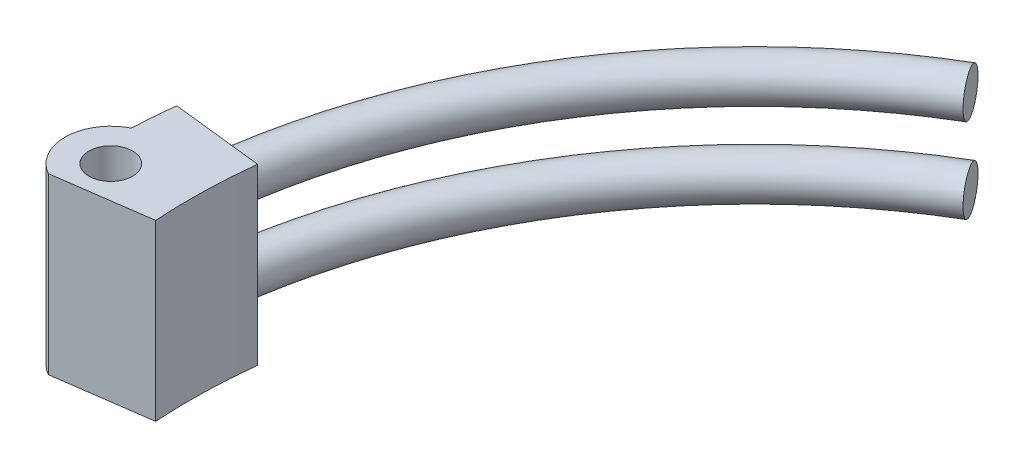
ISO-10303-21;
HEADER;
FILE_DESCRIPTION(('STEP AP214'),'2;1');
FILE_NAME('part.step','',(''),(''),'','','');
FILE_SCHEMA(('AUTOMOTIVE_DESIGN { 1 0 10303 214 1 1 1 1 }'));
ENDSEC;
DATA;
#1=APPLICATION_CONTEXT('core data for automotive mechanical design processes');
#2=APPLICATION_PROTOCOL_DEFINITION('international standard','automotive_design',2000,#1);
#3=PRODUCT_CONTEXT('',#1,'mechanical');
#4=PRODUCT('Part','Part','',(#3));
#5=PRODUCT_RELATED_PRODUCT_CATEGORY('part','',(#4));
#6=PRODUCT_DEFINITION_FORMATION('','',#4);
#7=PRODUCT_DEFINITION_CONTEXT('part definition',#1,'design');
#8=PRODUCT_DEFINITION('design','',#6,#7);
#9=PRODUCT_DEFINITION_SHAPE('','',#8);
#10=(LENGTH_UNIT() NAMED_UNIT(*) SI_UNIT(.MILLI.,.METRE.));
#11=(NAMED_UNIT(*) PLANE_ANGLE_UNIT() SI_UNIT($,.RADIAN.));
#12=(NAMED_UNIT(*) SI_UNIT($,.STERADIAN.) SOLID_ANGLE_UNIT());
#13=UNCERTAINTY_MEASURE_WITH_UNIT(LENGTH_MEASURE(1.E-05),#10,'distance_accuracy_value','');
#14=(GEOMETRIC_REPRESENTATION_CONTEXT(3) GLOBAL_UNCERTAINTY_ASSIGNED_CONTEXT((#13)) GLOBAL_UNIT_ASSIGNED_CONTEXT((#10,
#11,#12)) REPRESENTATION_CONTEXT('',''));
#15=CARTESIAN_POINT('',(0.,0.,0.));
#16=DIRECTION('',(0.,0.,1.));
#17=DIRECTION('',(1.,0.,0.));
#18=AXIS2_PLACEMENT_3D('',#15,#16,#17);
#19=CARTESIAN_POINT('',(-44.9944892611387,12.35,0.668082567043454));
#20=DIRECTION('',(0.,-1.,0.));
#21=DIRECTION('',(0.,0.,-1.));
#22=AXIS2_PLACEMENT_3D('',#19,#20,#21);
#23=CYLINDRICAL_SURFACE('',#22,3.25);
#24=CARTESIAN_POINT('',(-44.9944892611387,0.,0.668082567043454));
#25=DIRECTION('',(0.,1.,0.));
#26=DIRECTION('',(0.,0.,1.));
#27=AXIS2_PLACEMENT_3D('',#24,#25,#26);
#28=CIRCLE('',#27,3.25);
#29=CARTESIAN_POINT('',(-46.4460276498831,0.,-2.23975792136057));
#30=VERTEX_POINT('',#29);
#31=CARTESIAN_POINT('',(-46.5916336852475,0.,3.49856480308348));
#32=VERTEX_POINT('',#31);
#33=EDGE_CURVE('E132',#30,#32,#28,.T.);
#34=ORIENTED_EDGE('',*,*,#33,.T.);
#35=DIRECTION('',(0.,-1.,0.));
#36=VECTOR('',#35,1.);
#37=CARTESIAN_POINT('',(-46.5916336852475,12.35,3.49856480308348));
#38=LINE('',#37,#36);
#39=CARTESIAN_POINT('',(-46.5916336852475,12.35,3.49856480308348));
#40=VERTEX_POINT('',#39);
#41=EDGE_CURVE('E157',#40,#32,#38,.T.);
#42=ORIENTED_EDGE('',*,*,#41,.F.);
#43=CARTESIAN_POINT('',(-44.9944892611387,12.35,0.668082567043454));
#44=DIRECTION('',(0.,1.,0.));
#45=DIRECTION('',(0.,0.,1.));
#46=AXIS2_PLACEMENT_3D('',#43,#44,#45);
#47=CIRCLE('',#46,3.25);
#48=CARTESIAN_POINT('',(-46.4460276498831,12.35,-2.23975792136057));
#49=VERTEX_POINT('',#48);
#50=EDGE_CURVE('E92',#49,#40,#47,.T.);
#51=ORIENTED_EDGE('',*,*,#50,.F.);
#52=DIRECTION('',(0.,-1.,0.));
#53=VECTOR('',#52,1.);
#54=CARTESIAN_POINT('',(-46.4460276498831,12.35,-2.23975792136057));
#55=LINE('',#54,#53);
#56=EDGE_CURVE('E131',#49,#30,#55,.T.);
#57=ORIENTED_EDGE('',*,*,#56,.T.);
#58=EDGE_LOOP('',(#34,#42,#51,#57));
#59=FACE_BOUND('',#58,.T.);
#60=ADVANCED_FACE('F47',(#59),#23,.T.);
#61=CARTESIAN_POINT('',(-0.416258637072945,12.35,-2.97098110849971));
#62=DIRECTION('',(0.138752879024315,0.,0.99032703616657));
#63=DIRECTION('',(0.99032703616657,0.,-0.138752879024315));
#64=AXIS2_PLACEMENT_3D('',#61,#62,#63);
#65=PLANE('',#64);
#66=DIRECTION('',(-0.99032703616657,0.,0.138752879024315));
#67=VECTOR('',#66,1.);
#68=CARTESIAN_POINT('',(-0.416258637072945,0.,-2.97098110849971));
#69=LINE('',#68,#67);
#70=CARTESIAN_POINT('',(-39.9177711771375,0.,2.5635023404881));
#71=VERTEX_POINT('',#70);
#72=EDGE_CURVE('E136',#71,#32,#69,.T.);
#73=ORIENTED_EDGE('',*,*,#72,.F.);
#74=DIRECTION('',(0.,-1.,0.));
#75=VECTOR('',#74,1.);
#76=CARTESIAN_POINT('',(-39.9177711771375,12.35,2.5635023404881));
#77=LINE('',#76,#75);
#78=CARTESIAN_POINT('',(-39.9177711771375,12.35,2.5635023404881));
#79=VERTEX_POINT('',#78);
#80=EDGE_CURVE('E118',#79,#71,#77,.T.);
#81=ORIENTED_EDGE('',*,*,#80,.F.);
#82=DIRECTION('',(-0.99032703616657,0.,0.138752879024315));
#83=VECTOR('',#82,1.);
#84=CARTESIAN_POINT('',(-0.416258637072945,12.35,-2.97098110849971));
#85=LINE('',#84,#83);
#86=EDGE_CURVE('E105',#79,#40,#85,.T.);
#87=ORIENTED_EDGE('',*,*,#86,.T.);
#88=ORIENTED_EDGE('',*,*,#41,.T.);
#89=EDGE_LOOP('',(#73,#81,#87,#88));
#90=FACE_BOUND('',#89,.T.);
#91=ADVANCED_FACE('F174',(#90),#65,.T.);
#92=CARTESIAN_POINT('',(0.,12.35,0.));
#93=DIRECTION('',(0.,-1.,0.));
#94=DIRECTION('',(0.,0.,-1.));
#95=AXIS2_PLACEMENT_3D('',#92,#93,#94);
#96=CYLINDRICAL_SURFACE('',#95,40.);
#97=CARTESIAN_POINT('',(0.,0.,0.));
#98=DIRECTION('',(0.,1.,0.));
#99=DIRECTION('',(0.,0.,1.));
#100=AXIS2_PLACEMENT_3D('',#97,#98,#99);
#101=CIRCLE('',#100,40.);
#102=CARTESIAN_POINT('',(-39.7464722826174,0.,-4.49643648761212));
#103=VERTEX_POINT('',#102);
#104=EDGE_CURVE('E113',#71,#103,#101,.F.);
#105=ORIENTED_EDGE('',*,*,#104,.T.);
#106=DIRECTION('',(0.,-1.,0.));
#107=VECTOR('',#106,1.);
#108=CARTESIAN_POINT('',(-39.7464722826174,12.35,-4.49643648761212));
#109=LINE('',#108,#107);
#110=CARTESIAN_POINT('',(-39.7464722826174,12.35,-4.49643648761212));
#111=VERTEX_POINT('',#110);
#112=EDGE_CURVE('E110',#111,#103,#109,.T.);
#113=ORIENTED_EDGE('',*,*,#112,.F.);
#114=CARTESIAN_POINT('',(0.,12.35,0.));
#115=DIRECTION('',(0.,1.,0.));
#116=DIRECTION('',(0.,0.,1.));
#117=AXIS2_PLACEMENT_3D('',#114,#115,#116);
#118=CIRCLE('',#117,40.);
#119=EDGE_CURVE('E98',#79,#111,#118,.F.);
#120=ORIENTED_EDGE('',*,*,#119,.F.);
#121=ORIENTED_EDGE('',*,*,#80,.T.);
#122=EDGE_LOOP('',(#105,#113,#120,#121));
#123=FACE_BOUND('',#122,.T.);
#124=ADVANCED_FACE('F111',(#123),#96,.F.);
#125=CARTESIAN_POINT('',(0.,12.35,0.));
#126=DIRECTION('',(0.112410912190303,0.,-0.993661807065434));
#127=DIRECTION('',(-0.993661807065434,0.,-0.112410912190303));
#128=AXIS2_PLACEMENT_3D('',#125,#126,#127);
#129=PLANE('',#128);
#130=CARTESIAN_POINT('',(-43.1249224266398,3.175,-4.87863358905914));
#131=DIRECTION('',(0.112410912190303,0.,-0.993661807065434));
#132=DIRECTION('',(-0.993661807065434,0.,-0.112410912190303));
#133=AXIS2_PLACEMENT_3D('',#130,#131,#132);
#134=CIRCLE('',#133,1.50000000000001);
#135=CARTESIAN_POINT('',(-44.615415137238,3.175,-5.0472499573446));
#136=VERTEX_POINT('',#135);
#137=EDGE_CURVE('E11',#136,#136,#134,.T.);
#138=ORIENTED_EDGE('',*,*,#137,.F.);
#139=EDGE_LOOP('',(#138));
#140=FACE_BOUND('',#139,.T.);
#141=CARTESIAN_POINT('',(-43.1249224266398,9.175,-4.87863358905914));
#142=DIRECTION('',(0.112410912190303,0.,-0.993661807065434));
#143=DIRECTION('',(-0.993661807065434,0.,-0.112410912190303));
#144=AXIS2_PLACEMENT_3D('',#141,#142,#143);
#145=CIRCLE('',#144,1.50000000000001);
#146=CARTESIAN_POINT('',(-44.615415137238,9.175,-5.0472499573446));
#147=VERTEX_POINT('',#146);
#148=EDGE_CURVE('E56',#147,#147,#145,.T.);
#149=ORIENTED_EDGE('',*,*,#148,.F.);
#150=EDGE_LOOP('',(#149));
#151=FACE_BOUND('',#150,.T.);
#152=DIRECTION('',(0.993661807065434,0.,0.112410912190303));
#153=VECTOR('',#152,1.);
#154=CARTESIAN_POINT('',(0.,0.,0.));
#155=LINE('',#154,#153);
#156=CARTESIAN_POINT('',(-46.2052740285427,0.,-5.22710741684909));
#157=VERTEX_POINT('',#156);
#158=EDGE_CURVE('E143',#157,#103,#155,.T.);
#159=ORIENTED_EDGE('',*,*,#158,.F.);
#160=DIRECTION('',(0.,-1.,0.));
#161=VECTOR('',#160,1.);
#162=CARTESIAN_POINT('',(-46.2052740285427,12.35,-5.22710741684909));
#163=LINE('',#162,#161);
#164=CARTESIAN_POINT('',(-46.2052740285427,12.35,-5.22710741684909));
#165=VERTEX_POINT('',#164);
#166=EDGE_CURVE('E83',#165,#157,#163,.T.);
#167=ORIENTED_EDGE('',*,*,#166,.F.);
#168=DIRECTION('',(0.993661807065434,0.,0.112410912190303));
#169=VECTOR('',#168,1.);
#170=CARTESIAN_POINT('',(0.,12.35,0.));
#171=LINE('',#170,#169);
#172=EDGE_CURVE('E103',#165,#111,#171,.T.);
#173=ORIENTED_EDGE('',*,*,#172,.T.);
#174=ORIENTED_EDGE('',*,*,#112,.T.);
#175=EDGE_LOOP('',(#159,#167,#173,#174));
#176=FACE_BOUND('',#175,.T.);
#177=ADVANCED_FACE('F120',(#140,#151,#176),#129,.T.);
#178=CARTESIAN_POINT('',(0.,12.35,0.));
#179=DIRECTION('',(0.,-1.,0.));
#180=DIRECTION('',(0.,0.,-1.));
#181=AXIS2_PLACEMENT_3D('',#178,#179,#180);
#182=CYLINDRICAL_SURFACE('',#181,46.5);
#183=CARTESIAN_POINT('',(0.,0.,0.));
#184=DIRECTION('',(0.,1.,0.));
#185=DIRECTION('',(0.,0.,1.));
#186=AXIS2_PLACEMENT_3D('',#183,#184,#185);
#187=CIRCLE('',#186,46.5);
#188=EDGE_CURVE('E86',#157,#30,#187,.T.);
#189=ORIENTED_EDGE('',*,*,#188,.T.);
#190=ORIENTED_EDGE('',*,*,#56,.F.);
#191=CARTESIAN_POINT('',(0.,12.35,0.));
#192=DIRECTION('',(0.,1.,0.));
#193=DIRECTION('',(0.,0.,1.));
#194=AXIS2_PLACEMENT_3D('',#191,#192,#193);
#195=CIRCLE('',#194,46.5);
#196=EDGE_CURVE('E64',#165,#49,#195,.T.);
#197=ORIENTED_EDGE('',*,*,#196,.F.);
#198=ORIENTED_EDGE('',*,*,#166,.T.);
#199=EDGE_LOOP('',(#189,#190,#197,#198));
#200=FACE_BOUND('',#199,.T.);
#201=ADVANCED_FACE('F180',(#200),#182,.T.);
#202=CARTESIAN_POINT('',(-44.9944892611387,12.35,0.668082567043454));
#203=DIRECTION('',(0.,-1.,0.));
#204=DIRECTION('',(0.,0.,-1.));
#205=AXIS2_PLACEMENT_3D('',#202,#203,#204);
#206=CYLINDRICAL_SURFACE('',#205,1.55);
#207=CARTESIAN_POINT('',(-44.9944892611387,12.35,0.668082567043454));
#208=DIRECTION('',(0.,1.,0.));
#209=DIRECTION('',(0.,0.,1.));
#210=AXIS2_PLACEMENT_3D('',#207,#208,#209);
#211=CIRCLE('',#210,1.55);
#212=CARTESIAN_POINT('',(-44.9944892611387,12.35,2.21808256704346));
#213=VERTEX_POINT('',#212);
#214=EDGE_CURVE('E124',#213,#213,#211,.T.);
#215=ORIENTED_EDGE('',*,*,#214,.T.);
#216=EDGE_LOOP('',(#215));
#217=FACE_BOUND('',#216,.T.);
#218=CARTESIAN_POINT('',(-44.9944892611387,0.,0.668082567043454));
#219=DIRECTION('',(0.,1.,0.));
#220=DIRECTION('',(0.,0.,1.));
#221=AXIS2_PLACEMENT_3D('',#218,#219,#220);
#222=CIRCLE('',#221,1.55);
#223=CARTESIAN_POINT('',(-44.9944892611387,0.,2.21808256704346));
#224=VERTEX_POINT('',#223);
#225=EDGE_CURVE('E148',#224,#224,#222,.T.);
#226=ORIENTED_EDGE('',*,*,#225,.F.);
#227=EDGE_LOOP('',(#226));
#228=FACE_BOUND('',#227,.T.);
#229=ADVANCED_FACE('F182',(#217,#228),#206,.F.);
#230=CARTESIAN_POINT('',(0.,12.35,0.));
#231=DIRECTION('',(0.,1.,0.));
#232=DIRECTION('',(0.,0.,1.));
#233=AXIS2_PLACEMENT_3D('',#230,#231,#232);
#234=PLANE('',#233);
#235=ORIENTED_EDGE('',*,*,#50,.T.);
#236=ORIENTED_EDGE('',*,*,#86,.F.);
#237=ORIENTED_EDGE('',*,*,#119,.T.);
#238=ORIENTED_EDGE('',*,*,#172,.F.);
#239=ORIENTED_EDGE('',*,*,#196,.T.);
#240=EDGE_LOOP('',(#235,#236,#237,#238,#239));
#241=FACE_BOUND('',#240,.T.);
#242=ORIENTED_EDGE('',*,*,#214,.F.);
#243=EDGE_LOOP('',(#242));
#244=FACE_BOUND('',#243,.T.);
#245=ADVANCED_FACE('F100',(#241,#244),#234,.T.);
#246=CARTESIAN_POINT('',(0.,0.,0.));
#247=DIRECTION('',(0.,1.,0.));
#248=DIRECTION('',(0.,0.,1.));
#249=AXIS2_PLACEMENT_3D('',#246,#247,#248);
#250=PLANE('',#249);
#251=ORIENTED_EDGE('',*,*,#33,.F.);
#252=ORIENTED_EDGE('',*,*,#188,.F.);
#253=ORIENTED_EDGE('',*,*,#158,.T.);
#254=ORIENTED_EDGE('',*,*,#104,.F.);
#255=ORIENTED_EDGE('',*,*,#72,.T.);
#256=EDGE_LOOP('',(#251,#252,#253,#254,#255));
#257=FACE_BOUND('',#256,.T.);
#258=ORIENTED_EDGE('',*,*,#225,.T.);
#259=EDGE_LOOP('',(#258));
#260=FACE_BOUND('',#259,.T.);
#261=ADVANCED_FACE('F177',(#257,#260),#250,.F.);
#262=CARTESIAN_POINT('',(-22.0569761638864,9.175,-37.3771294042995));
#263=DIRECTION('',(0.861224179822569,0.,-0.508225257232405));
#264=DIRECTION('',(-0.508225257232405,0.,-0.861224179822569));
#265=AXIS2_PLACEMENT_3D('',#262,#263,#264);
#266=PLANE('',#265);
#267=CARTESIAN_POINT('',(-22.0569761638864,9.175,-37.3771294042995));
#268=DIRECTION('',(0.861224179822569,0.,-0.508225257232405));
#269=DIRECTION('',(-0.508225257232405,0.,-0.861224179822569));
#270=AXIS2_PLACEMENT_3D('',#267,#268,#269);
#271=CIRCLE('',#270,1.50000000000001);
#272=CARTESIAN_POINT('',(-22.819314049735,9.175,-38.6689656740333));
#273=VERTEX_POINT('',#272);
#274=EDGE_CURVE('E137',#273,#273,#271,.T.);
#275=ORIENTED_EDGE('',*,*,#274,.T.);
#276=EDGE_LOOP('',(#275));
#277=FACE_BOUND('',#276,.T.);
#278=ADVANCED_FACE('F247',(#277),#266,.T.);
#279=CARTESIAN_POINT('',(0.,9.175,0.));
#280=DIRECTION('',(0.,-1.,0.));
#281=DIRECTION('',(0.,0.,-1.));
#282=AXIS2_PLACEMENT_3D('',#279,#280,#281);
#283=TOROIDAL_SURFACE('',#282,43.4,1.50000000000001);
#284=CARTESIAN_POINT('',(0.,9.175,0.));
#285=DIRECTION('',(0.,-1.,0.));
#286=DIRECTION('',(0.,0.,-1.));
#287=AXIS2_PLACEMENT_3D('',#284,#285,#286);
#288=CIRCLE('',#287,44.9);
#289=EDGE_CURVE('',#147,#273,#288,.T.);
#290=ORIENTED_EDGE('',*,*,#148,.T.);
#291=ORIENTED_EDGE('',*,*,#274,.F.);
#292=ORIENTED_EDGE('',*,*,#289,.T.);
#293=ORIENTED_EDGE('',*,*,#289,.F.);
#294=EDGE_LOOP('',(#290,#292,#291,#293));
#295=FACE_BOUND('',#294,.T.);
#296=ADVANCED_FACE('F249',(#295),#283,.T.);
#297=CARTESIAN_POINT('',(-22.0569761638864,3.175,-37.3771294042995));
#298=DIRECTION('',(0.861224179822569,0.,-0.508225257232405));
#299=DIRECTION('',(-0.508225257232405,0.,-0.861224179822569));
#300=AXIS2_PLACEMENT_3D('',#297,#298,#299);
#301=PLANE('',#300);
#302=CARTESIAN_POINT('',(-22.0569761638864,3.175,-37.3771294042995));
#303=DIRECTION('',(0.861224179822569,0.,-0.508225257232405));
#304=DIRECTION('',(-0.508225257232405,0.,-0.861224179822569));
#305=AXIS2_PLACEMENT_3D('',#302,#303,#304);
#306=CIRCLE('',#305,1.50000000000001);
#307=CARTESIAN_POINT('',(-22.819314049735,3.175,-38.6689656740333));
#308=VERTEX_POINT('',#307);
#309=EDGE_CURVE('E168',#308,#308,#306,.T.);
#310=ORIENTED_EDGE('',*,*,#309,.T.);
#311=EDGE_LOOP('',(#310));
#312=FACE_BOUND('',#311,.T.);
#313=ADVANCED_FACE('F272',(#312),#301,.T.);
#314=CARTESIAN_POINT('',(0.,3.175,0.));
#315=DIRECTION('',(0.,-1.,0.));
#316=DIRECTION('',(0.,0.,-1.));
#317=AXIS2_PLACEMENT_3D('',#314,#315,#316);
#318=TOROIDAL_SURFACE('',#317,43.4,1.50000000000001);
#319=CARTESIAN_POINT('',(0.,3.175,0.));
#320=DIRECTION('',(0.,-1.,0.));
#321=DIRECTION('',(0.,0.,-1.));
#322=AXIS2_PLACEMENT_3D('',#319,#320,#321);
#323=CIRCLE('',#322,44.9);
#324=EDGE_CURVE('',#136,#308,#323,.T.);
#325=ORIENTED_EDGE('',*,*,#137,.T.);
#326=ORIENTED_EDGE('',*,*,#309,.F.);
#327=ORIENTED_EDGE('',*,*,#324,.T.);
#328=ORIENTED_EDGE('',*,*,#324,.F.);
#329=EDGE_LOOP('',(#325,#327,#326,#328));
#330=FACE_BOUND('',#329,.T.);
#331=ADVANCED_FACE('F264',(#330),#318,.T.);
#332=CLOSED_SHELL('',(#60,#91,#124,#177,#201,#229,#245,#261,#278,#296,#313,#331));
#333=MANIFOLD_SOLID_BREP('B2',#332);
#334=ADVANCED_BREP_SHAPE_REPRESENTATION('',(#18,#333),#14);
#335=SHAPE_DEFINITION_REPRESENTATION(#9,#334);
ENDSEC;
END-ISO-10303-21;
